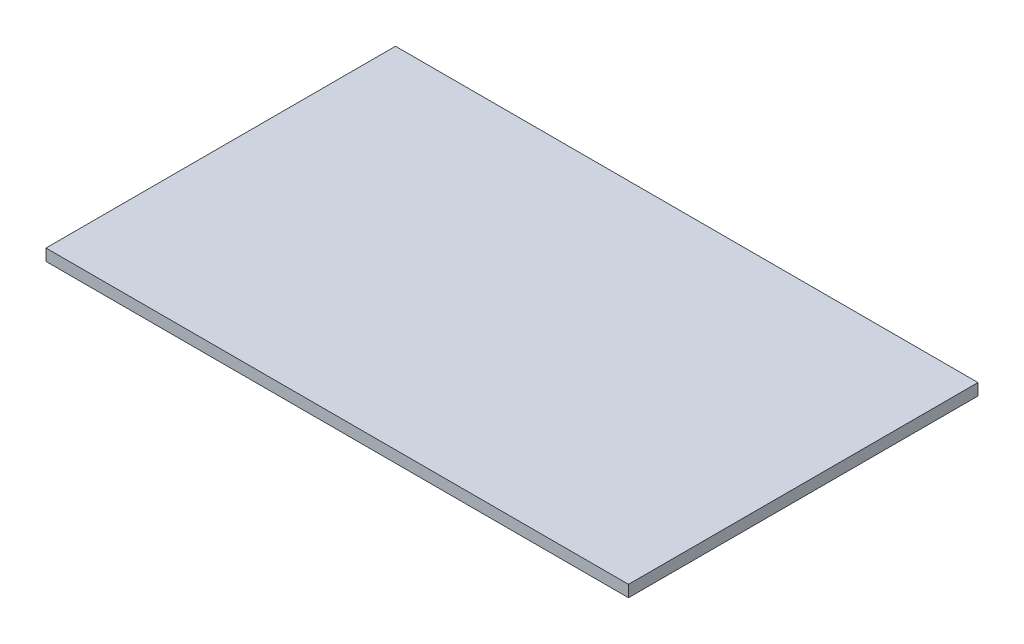
ISO-10303-21;
HEADER;
FILE_DESCRIPTION(('STEP AP214'),'2;1');
FILE_NAME('part.step','',(''),(''),'','','');
FILE_SCHEMA(('AUTOMOTIVE_DESIGN { 1 0 10303 214 1 1 1 1 }'));
ENDSEC;
DATA;
#1=APPLICATION_CONTEXT('core data for automotive mechanical design processes');
#2=APPLICATION_PROTOCOL_DEFINITION('international standard','automotive_design',2000,#1);
#3=PRODUCT_CONTEXT('',#1,'mechanical');
#4=PRODUCT('Part','Part','',(#3));
#5=PRODUCT_RELATED_PRODUCT_CATEGORY('part','',(#4));
#6=PRODUCT_DEFINITION_FORMATION('','',#4);
#7=PRODUCT_DEFINITION_CONTEXT('part definition',#1,'design');
#8=PRODUCT_DEFINITION('design','',#6,#7);
#9=PRODUCT_DEFINITION_SHAPE('','',#8);
#10=(LENGTH_UNIT() NAMED_UNIT(*) SI_UNIT(.MILLI.,.METRE.));
#11=(NAMED_UNIT(*) PLANE_ANGLE_UNIT() SI_UNIT($,.RADIAN.));
#12=(NAMED_UNIT(*) SI_UNIT($,.STERADIAN.) SOLID_ANGLE_UNIT());
#13=UNCERTAINTY_MEASURE_WITH_UNIT(LENGTH_MEASURE(1.E-05),#10,'distance_accuracy_value','');
#14=(GEOMETRIC_REPRESENTATION_CONTEXT(3) GLOBAL_UNCERTAINTY_ASSIGNED_CONTEXT((#13)) GLOBAL_UNIT_ASSIGNED_CONTEXT((#10,
#11,#12)) REPRESENTATION_CONTEXT('',''));
#15=CARTESIAN_POINT('',(0.,0.,0.));
#16=DIRECTION('',(0.,0.,1.));
#17=DIRECTION('',(1.,0.,0.));
#18=AXIS2_PLACEMENT_3D('',#15,#16,#17);
#19=CARTESIAN_POINT('',(250.,10.,150.));
#20=DIRECTION('',(-1.,0.,0.));
#21=DIRECTION('',(0.,0.,1.));
#22=AXIS2_PLACEMENT_3D('',#19,#20,#21);
#23=PLANE('',#22);
#24=DIRECTION('',(0.,0.,-1.));
#25=VECTOR('',#24,1.);
#26=CARTESIAN_POINT('',(250.,0.,150.));
#27=LINE('',#26,#25);
#28=CARTESIAN_POINT('',(250.,0.,150.));
#29=VERTEX_POINT('',#28);
#30=CARTESIAN_POINT('',(250.,0.,-150.));
#31=VERTEX_POINT('',#30);
#32=EDGE_CURVE('E95',#29,#31,#27,.T.);
#33=ORIENTED_EDGE('',*,*,#32,.T.);
#34=DIRECTION('',(0.,-1.,0.));
#35=VECTOR('',#34,1.);
#36=CARTESIAN_POINT('',(250.,10.,-150.));
#37=LINE('',#36,#35);
#38=CARTESIAN_POINT('',(250.,10.,-150.));
#39=VERTEX_POINT('',#38);
#40=EDGE_CURVE('E11',#39,#31,#37,.T.);
#41=ORIENTED_EDGE('',*,*,#40,.F.);
#42=DIRECTION('',(0.,0.,-1.));
#43=VECTOR('',#42,1.);
#44=CARTESIAN_POINT('',(250.,10.,150.));
#45=LINE('',#44,#43);
#46=CARTESIAN_POINT('',(250.,10.,150.));
#47=VERTEX_POINT('',#46);
#48=EDGE_CURVE('E83',#47,#39,#45,.T.);
#49=ORIENTED_EDGE('',*,*,#48,.F.);
#50=DIRECTION('',(0.,-1.,0.));
#51=VECTOR('',#50,1.);
#52=CARTESIAN_POINT('',(250.,10.,150.));
#53=LINE('',#52,#51);
#54=EDGE_CURVE('E91',#47,#29,#53,.T.);
#55=ORIENTED_EDGE('',*,*,#54,.T.);
#56=EDGE_LOOP('',(#33,#41,#49,#55));
#57=FACE_BOUND('',#56,.T.);
#58=ADVANCED_FACE('F32',(#57),#23,.F.);
#59=CARTESIAN_POINT('',(-250.,10.,-150.));
#60=DIRECTION('',(0.,0.,1.));
#61=DIRECTION('',(1.,0.,0.));
#62=AXIS2_PLACEMENT_3D('',#59,#60,#61);
#63=PLANE('',#62);
#64=DIRECTION('',(-1.,0.,0.));
#65=VECTOR('',#64,1.);
#66=CARTESIAN_POINT('',(-250.,0.,-150.));
#67=LINE('',#66,#65);
#68=CARTESIAN_POINT('',(-250.,0.,-150.));
#69=VERTEX_POINT('',#68);
#70=EDGE_CURVE('E87',#31,#69,#67,.T.);
#71=ORIENTED_EDGE('',*,*,#70,.T.);
#72=DIRECTION('',(0.,-1.,0.));
#73=VECTOR('',#72,1.);
#74=CARTESIAN_POINT('',(-250.,10.,-150.));
#75=LINE('',#74,#73);
#76=CARTESIAN_POINT('',(-250.,10.,-150.));
#77=VERTEX_POINT('',#76);
#78=EDGE_CURVE('E40',#77,#69,#75,.T.);
#79=ORIENTED_EDGE('',*,*,#78,.F.);
#80=DIRECTION('',(-1.,0.,0.));
#81=VECTOR('',#80,1.);
#82=CARTESIAN_POINT('',(-250.,10.,-150.));
#83=LINE('',#82,#81);
#84=EDGE_CURVE('E78',#39,#77,#83,.T.);
#85=ORIENTED_EDGE('',*,*,#84,.F.);
#86=ORIENTED_EDGE('',*,*,#40,.T.);
#87=EDGE_LOOP('',(#71,#79,#85,#86));
#88=FACE_BOUND('',#87,.T.);
#89=ADVANCED_FACE('F86',(#88),#63,.F.);
#90=CARTESIAN_POINT('',(-250.,10.,150.));
#91=DIRECTION('',(1.,0.,0.));
#92=DIRECTION('',(0.,0.,-1.));
#93=AXIS2_PLACEMENT_3D('',#90,#91,#92);
#94=PLANE('',#93);
#95=DIRECTION('',(0.,0.,1.));
#96=VECTOR('',#95,1.);
#97=CARTESIAN_POINT('',(-250.,0.,150.));
#98=LINE('',#97,#96);
#99=CARTESIAN_POINT('',(-250.,0.,150.));
#100=VERTEX_POINT('',#99);
#101=EDGE_CURVE('E65',#69,#100,#98,.T.);
#102=ORIENTED_EDGE('',*,*,#101,.T.);
#103=DIRECTION('',(0.,-1.,0.));
#104=VECTOR('',#103,1.);
#105=CARTESIAN_POINT('',(-250.,10.,150.));
#106=LINE('',#105,#104);
#107=CARTESIAN_POINT('',(-250.,10.,150.));
#108=VERTEX_POINT('',#107);
#109=EDGE_CURVE('E88',#108,#100,#106,.T.);
#110=ORIENTED_EDGE('',*,*,#109,.F.);
#111=DIRECTION('',(0.,0.,1.));
#112=VECTOR('',#111,1.);
#113=CARTESIAN_POINT('',(-250.,10.,150.));
#114=LINE('',#113,#112);
#115=EDGE_CURVE('E81',#77,#108,#114,.T.);
#116=ORIENTED_EDGE('',*,*,#115,.F.);
#117=ORIENTED_EDGE('',*,*,#78,.T.);
#118=EDGE_LOOP('',(#102,#110,#116,#117));
#119=FACE_BOUND('',#118,.T.);
#120=ADVANCED_FACE('F89',(#119),#94,.F.);
#121=CARTESIAN_POINT('',(-250.,10.,150.));
#122=DIRECTION('',(0.,0.,-1.));
#123=DIRECTION('',(-1.,0.,0.));
#124=AXIS2_PLACEMENT_3D('',#121,#122,#123);
#125=PLANE('',#124);
#126=DIRECTION('',(1.,0.,0.));
#127=VECTOR('',#126,1.);
#128=CARTESIAN_POINT('',(-250.,0.,150.));
#129=LINE('',#128,#127);
#130=EDGE_CURVE('E71',#100,#29,#129,.T.);
#131=ORIENTED_EDGE('',*,*,#130,.T.);
#132=ORIENTED_EDGE('',*,*,#54,.F.);
#133=DIRECTION('',(1.,0.,0.));
#134=VECTOR('',#133,1.);
#135=CARTESIAN_POINT('',(-250.,10.,150.));
#136=LINE('',#135,#134);
#137=EDGE_CURVE('E48',#108,#47,#136,.T.);
#138=ORIENTED_EDGE('',*,*,#137,.F.);
#139=ORIENTED_EDGE('',*,*,#109,.T.);
#140=EDGE_LOOP('',(#131,#132,#138,#139));
#141=FACE_BOUND('',#140,.T.);
#142=ADVANCED_FACE('F102',(#141),#125,.F.);
#143=CARTESIAN_POINT('',(0.,10.,0.));
#144=DIRECTION('',(0.,-1.,0.));
#145=DIRECTION('',(0.,0.,-1.));
#146=AXIS2_PLACEMENT_3D('',#143,#144,#145);
#147=PLANE('',#146);
#148=ORIENTED_EDGE('',*,*,#48,.T.);
#149=ORIENTED_EDGE('',*,*,#84,.T.);
#150=ORIENTED_EDGE('',*,*,#115,.T.);
#151=ORIENTED_EDGE('',*,*,#137,.T.);
#152=EDGE_LOOP('',(#148,#149,#150,#151));
#153=FACE_BOUND('',#152,.T.);
#154=ADVANCED_FACE('F79',(#153),#147,.F.);
#155=CARTESIAN_POINT('',(0.,0.,0.));
#156=DIRECTION('',(0.,-1.,0.));
#157=DIRECTION('',(0.,0.,-1.));
#158=AXIS2_PLACEMENT_3D('',#155,#156,#157);
#159=PLANE('',#158);
#160=ORIENTED_EDGE('',*,*,#32,.F.);
#161=ORIENTED_EDGE('',*,*,#130,.F.);
#162=ORIENTED_EDGE('',*,*,#101,.F.);
#163=ORIENTED_EDGE('',*,*,#70,.F.);
#164=EDGE_LOOP('',(#160,#161,#162,#163));
#165=FACE_BOUND('',#164,.T.);
#166=ADVANCED_FACE('F105',(#165),#159,.T.);
#167=CLOSED_SHELL('',(#58,#89,#120,#142,#154,#166));
#168=MANIFOLD_SOLID_BREP('B2',#167);
#169=ADVANCED_BREP_SHAPE_REPRESENTATION('',(#18,#168),#14);
#170=SHAPE_DEFINITION_REPRESENTATION(#9,#169);
ENDSEC;
END-ISO-10303-21;
